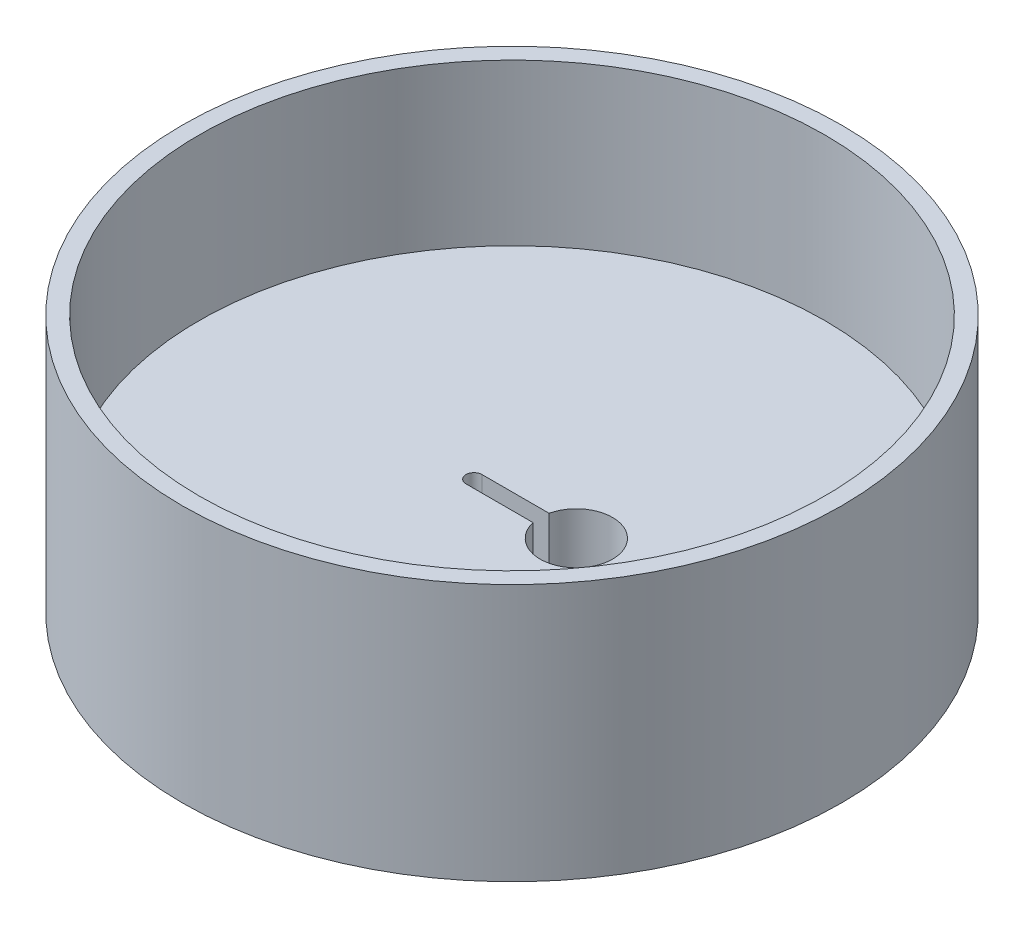
ISO-10303-21;
HEADER;
FILE_DESCRIPTION(('STEP AP214'),'2;1');
FILE_NAME('part.step','',(''),(''),'','','');
FILE_SCHEMA(('AUTOMOTIVE_DESIGN { 1 0 10303 214 1 1 1 1 }'));
ENDSEC;
DATA;
#1=APPLICATION_CONTEXT('core data for automotive mechanical design processes');
#2=APPLICATION_PROTOCOL_DEFINITION('international standard','automotive_design',2000,#1);
#3=PRODUCT_CONTEXT('',#1,'mechanical');
#4=PRODUCT('Part','Part','',(#3));
#5=PRODUCT_RELATED_PRODUCT_CATEGORY('part','',(#4));
#6=PRODUCT_DEFINITION_FORMATION('','',#4);
#7=PRODUCT_DEFINITION_CONTEXT('part definition',#1,'design');
#8=PRODUCT_DEFINITION('design','',#6,#7);
#9=PRODUCT_DEFINITION_SHAPE('','',#8);
#10=(LENGTH_UNIT() NAMED_UNIT(*) SI_UNIT(.MILLI.,.METRE.));
#11=(NAMED_UNIT(*) PLANE_ANGLE_UNIT() SI_UNIT($,.RADIAN.));
#12=(NAMED_UNIT(*) SI_UNIT($,.STERADIAN.) SOLID_ANGLE_UNIT());
#13=UNCERTAINTY_MEASURE_WITH_UNIT(LENGTH_MEASURE(1.E-05),#10,'distance_accuracy_value','');
#14=(GEOMETRIC_REPRESENTATION_CONTEXT(3) GLOBAL_UNCERTAINTY_ASSIGNED_CONTEXT((#13)) GLOBAL_UNIT_ASSIGNED_CONTEXT((#10,
#11,#12)) REPRESENTATION_CONTEXT('',''));
#15=CARTESIAN_POINT('',(0.,0.,0.));
#16=DIRECTION('',(0.,0.,1.));
#17=DIRECTION('',(1.,0.,0.));
#18=AXIS2_PLACEMENT_3D('',#15,#16,#17);
#19=CARTESIAN_POINT('',(0.,6.,0.));
#20=DIRECTION('',(0.,1.,0.));
#21=DIRECTION('',(0.,0.,1.));
#22=AXIS2_PLACEMENT_3D('',#19,#20,#21);
#23=PLANE('',#22);
#24=CARTESIAN_POINT('',(0.,6.,0.));
#25=DIRECTION('',(0.,1.,0.));
#26=DIRECTION('',(0.,0.,1.));
#27=AXIS2_PLACEMENT_3D('',#24,#25,#26);
#28=CIRCLE('',#27,19.45);
#29=CARTESIAN_POINT('',(0.,6.,19.45));
#30=VERTEX_POINT('',#29);
#31=EDGE_CURVE('E115',#30,#30,#28,.T.);
#32=ORIENTED_EDGE('',*,*,#31,.T.);
#33=EDGE_LOOP('',(#32));
#34=FACE_BOUND('',#33,.T.);
#35=DIRECTION('',(-1.,0.,0.));
#36=VECTOR('',#35,1.);
#37=CARTESIAN_POINT('',(1.80625890315197,6.,-0.5));
#38=LINE('',#37,#36);
#39=CARTESIAN_POINT('',(1.80625890315197,6.,-0.5));
#40=VERTEX_POINT('',#39);
#41=CARTESIAN_POINT('',(-2.36322899103991,6.,-0.5));
#42=VERTEX_POINT('',#41);
#43=EDGE_CURVE('E94',#40,#42,#38,.T.);
#44=ORIENTED_EDGE('',*,*,#43,.F.);
#45=CARTESIAN_POINT('',(4.,6.,0.));
#46=DIRECTION('',(0.,1.,0.));
#47=DIRECTION('',(0.,0.,1.));
#48=AXIS2_PLACEMENT_3D('',#45,#46,#47);
#49=CIRCLE('',#48,2.25);
#50=CARTESIAN_POINT('',(1.80625890315197,6.,0.499999999999999));
#51=VERTEX_POINT('',#50);
#52=EDGE_CURVE('E86',#51,#40,#49,.T.);
#53=ORIENTED_EDGE('',*,*,#52,.F.);
#54=DIRECTION('',(1.,0.,0.));
#55=VECTOR('',#54,1.);
#56=CARTESIAN_POINT('',(1.80625890315197,6.,0.499999999999999));
#57=LINE('',#56,#55);
#58=CARTESIAN_POINT('',(-2.36322899103991,6.,0.500000000000001));
#59=VERTEX_POINT('',#58);
#60=EDGE_CURVE('E107',#59,#51,#57,.T.);
#61=ORIENTED_EDGE('',*,*,#60,.F.);
#62=CARTESIAN_POINT('',(-2.36322899103991,6.,0.));
#63=DIRECTION('',(0.,1.,0.));
#64=DIRECTION('',(0.,0.,1.));
#65=AXIS2_PLACEMENT_3D('',#62,#63,#64);
#66=CIRCLE('',#65,0.5);
#67=EDGE_CURVE('E103',#42,#59,#66,.T.);
#68=ORIENTED_EDGE('',*,*,#67,.F.);
#69=EDGE_LOOP('',(#44,#53,#61,#68));
#70=FACE_BOUND('',#69,.T.);
#71=ADVANCED_FACE('F45',(#34,#70),#23,.T.);
#72=CARTESIAN_POINT('',(0.,0.,0.));
#73=DIRECTION('',(0.,1.,0.));
#74=DIRECTION('',(0.,0.,1.));
#75=AXIS2_PLACEMENT_3D('',#72,#73,#74);
#76=PLANE('',#75);
#77=CARTESIAN_POINT('',(4.,0.,0.));
#78=DIRECTION('',(0.,1.,0.));
#79=DIRECTION('',(0.,0.,1.));
#80=AXIS2_PLACEMENT_3D('',#77,#78,#79);
#81=CIRCLE('',#80,2.25);
#82=CARTESIAN_POINT('',(1.80625890315197,0.,0.499999999999999));
#83=VERTEX_POINT('',#82);
#84=CARTESIAN_POINT('',(1.80625890315197,0.,-0.5));
#85=VERTEX_POINT('',#84);
#86=EDGE_CURVE('E68',#83,#85,#81,.T.);
#87=ORIENTED_EDGE('',*,*,#86,.T.);
#88=DIRECTION('',(-1.,0.,0.));
#89=VECTOR('',#88,1.);
#90=CARTESIAN_POINT('',(1.80625890315197,0.,-0.5));
#91=LINE('',#90,#89);
#92=CARTESIAN_POINT('',(-2.36322899103991,0.,-0.5));
#93=VERTEX_POINT('',#92);
#94=EDGE_CURVE('E101',#85,#93,#91,.T.);
#95=ORIENTED_EDGE('',*,*,#94,.T.);
#96=CARTESIAN_POINT('',(-2.36322899103991,0.,0.));
#97=DIRECTION('',(0.,1.,0.));
#98=DIRECTION('',(0.,0.,1.));
#99=AXIS2_PLACEMENT_3D('',#96,#97,#98);
#100=CIRCLE('',#99,0.5);
#101=CARTESIAN_POINT('',(-2.36322899103991,0.,0.500000000000001));
#102=VERTEX_POINT('',#101);
#103=EDGE_CURVE('E118',#93,#102,#100,.T.);
#104=ORIENTED_EDGE('',*,*,#103,.T.);
#105=DIRECTION('',(1.,0.,0.));
#106=VECTOR('',#105,1.);
#107=CARTESIAN_POINT('',(1.80625890315197,0.,0.499999999999999));
#108=LINE('',#107,#106);
#109=EDGE_CURVE('E95',#102,#83,#108,.T.);
#110=ORIENTED_EDGE('',*,*,#109,.T.);
#111=EDGE_LOOP('',(#87,#95,#104,#110));
#112=FACE_BOUND('',#111,.T.);
#113=CARTESIAN_POINT('',(0.,0.,0.));
#114=DIRECTION('',(0.,1.,0.));
#115=DIRECTION('',(0.,0.,1.));
#116=AXIS2_PLACEMENT_3D('',#113,#114,#115);
#117=CIRCLE('',#116,20.5);
#118=CARTESIAN_POINT('',(0.,0.,20.5));
#119=VERTEX_POINT('',#118);
#120=EDGE_CURVE('E217',#119,#119,#117,.F.);
#121=ORIENTED_EDGE('',*,*,#120,.T.);
#122=EDGE_LOOP('',(#121));
#123=FACE_BOUND('',#122,.T.);
#124=ADVANCED_FACE('F47',(#112,#123),#76,.F.);
#125=CARTESIAN_POINT('',(4.,6.,0.));
#126=DIRECTION('',(0.,-1.,0.));
#127=DIRECTION('',(0.,0.,-1.));
#128=AXIS2_PLACEMENT_3D('',#125,#126,#127);
#129=CYLINDRICAL_SURFACE('',#128,2.25);
#130=ORIENTED_EDGE('',*,*,#86,.F.);
#131=DIRECTION('',(0.,-1.,0.));
#132=VECTOR('',#131,1.);
#133=CARTESIAN_POINT('',(1.80625890315197,6.,0.499999999999999));
#134=LINE('',#133,#132);
#135=EDGE_CURVE('E89',#51,#83,#134,.T.);
#136=ORIENTED_EDGE('',*,*,#135,.F.);
#137=ORIENTED_EDGE('',*,*,#52,.T.);
#138=DIRECTION('',(0.,-1.,0.));
#139=VECTOR('',#138,1.);
#140=CARTESIAN_POINT('',(1.80625890315197,6.,-0.5));
#141=LINE('',#140,#139);
#142=EDGE_CURVE('E11',#40,#85,#141,.T.);
#143=ORIENTED_EDGE('',*,*,#142,.T.);
#144=EDGE_LOOP('',(#130,#136,#137,#143));
#145=FACE_BOUND('',#144,.T.);
#146=ADVANCED_FACE('F88',(#145),#129,.F.);
#147=CARTESIAN_POINT('',(1.80625890315197,6.,-0.5));
#148=DIRECTION('',(0.,0.,1.));
#149=DIRECTION('',(1.,0.,0.));
#150=AXIS2_PLACEMENT_3D('',#147,#148,#149);
#151=PLANE('',#150);
#152=ORIENTED_EDGE('',*,*,#94,.F.);
#153=ORIENTED_EDGE('',*,*,#142,.F.);
#154=ORIENTED_EDGE('',*,*,#43,.T.);
#155=DIRECTION('',(0.,-1.,0.));
#156=VECTOR('',#155,1.);
#157=CARTESIAN_POINT('',(-2.36322899103991,6.,-0.5));
#158=LINE('',#157,#156);
#159=EDGE_CURVE('E54',#42,#93,#158,.T.);
#160=ORIENTED_EDGE('',*,*,#159,.T.);
#161=EDGE_LOOP('',(#152,#153,#154,#160));
#162=FACE_BOUND('',#161,.T.);
#163=ADVANCED_FACE('F98',(#162),#151,.T.);
#164=CARTESIAN_POINT('',(-2.36322899103991,6.,0.));
#165=DIRECTION('',(0.,-1.,0.));
#166=DIRECTION('',(0.,0.,-1.));
#167=AXIS2_PLACEMENT_3D('',#164,#165,#166);
#168=CYLINDRICAL_SURFACE('',#167,0.5);
#169=ORIENTED_EDGE('',*,*,#103,.F.);
#170=ORIENTED_EDGE('',*,*,#159,.F.);
#171=ORIENTED_EDGE('',*,*,#67,.T.);
#172=DIRECTION('',(0.,-1.,0.));
#173=VECTOR('',#172,1.);
#174=CARTESIAN_POINT('',(-2.36322899103991,6.,0.500000000000001));
#175=LINE('',#174,#173);
#176=EDGE_CURVE('E61',#59,#102,#175,.T.);
#177=ORIENTED_EDGE('',*,*,#176,.T.);
#178=EDGE_LOOP('',(#169,#170,#171,#177));
#179=FACE_BOUND('',#178,.T.);
#180=ADVANCED_FACE('F131',(#179),#168,.F.);
#181=CARTESIAN_POINT('',(1.80625890315197,6.,0.499999999999999));
#182=DIRECTION('',(0.,0.,-1.));
#183=DIRECTION('',(-1.,0.,0.));
#184=AXIS2_PLACEMENT_3D('',#181,#182,#183);
#185=PLANE('',#184);
#186=ORIENTED_EDGE('',*,*,#109,.F.);
#187=ORIENTED_EDGE('',*,*,#176,.F.);
#188=ORIENTED_EDGE('',*,*,#60,.T.);
#189=ORIENTED_EDGE('',*,*,#135,.T.);
#190=EDGE_LOOP('',(#186,#187,#188,#189));
#191=FACE_BOUND('',#190,.T.);
#192=ADVANCED_FACE('F134',(#191),#185,.T.);
#193=CARTESIAN_POINT('',(0.,-57.9827560572969,0.));
#194=DIRECTION('',(0.,1.,0.));
#195=DIRECTION('',(0.,0.,1.));
#196=AXIS2_PLACEMENT_3D('',#193,#194,#195);
#197=CYLINDRICAL_SURFACE('',#196,20.5);
#198=ORIENTED_EDGE('',*,*,#120,.F.);
#199=EDGE_LOOP('',(#198));
#200=FACE_BOUND('',#199,.T.);
#201=CARTESIAN_POINT('',(0.,16.,0.));
#202=DIRECTION('',(0.,1.,0.));
#203=DIRECTION('',(0.,0.,1.));
#204=AXIS2_PLACEMENT_3D('',#201,#202,#203);
#205=CIRCLE('',#204,20.5);
#206=CARTESIAN_POINT('',(0.,16.,20.5));
#207=VERTEX_POINT('',#206);
#208=EDGE_CURVE('E209',#207,#207,#205,.T.);
#209=ORIENTED_EDGE('',*,*,#208,.F.);
#210=EDGE_LOOP('',(#209));
#211=FACE_BOUND('',#210,.T.);
#212=ADVANCED_FACE('F136',(#200,#211),#197,.T.);
#213=CARTESIAN_POINT('',(0.,-57.9827560572969,0.));
#214=DIRECTION('',(0.,1.,0.));
#215=DIRECTION('',(0.,0.,1.));
#216=AXIS2_PLACEMENT_3D('',#213,#214,#215);
#217=CYLINDRICAL_SURFACE('',#216,19.45);
#218=ORIENTED_EDGE('',*,*,#31,.F.);
#219=EDGE_LOOP('',(#218));
#220=FACE_BOUND('',#219,.T.);
#221=CARTESIAN_POINT('',(0.,16.,0.));
#222=DIRECTION('',(0.,1.,0.));
#223=DIRECTION('',(0.,0.,1.));
#224=AXIS2_PLACEMENT_3D('',#221,#222,#223);
#225=CIRCLE('',#224,19.45);
#226=CARTESIAN_POINT('',(0.,16.,19.45));
#227=VERTEX_POINT('',#226);
#228=EDGE_CURVE('E212',#227,#227,#225,.T.);
#229=ORIENTED_EDGE('',*,*,#228,.T.);
#230=EDGE_LOOP('',(#229));
#231=FACE_BOUND('',#230,.T.);
#232=ADVANCED_FACE('F143',(#220,#231),#217,.F.);
#233=CARTESIAN_POINT('',(0.,16.,0.));
#234=DIRECTION('',(0.,1.,0.));
#235=DIRECTION('',(0.,0.,1.));
#236=AXIS2_PLACEMENT_3D('',#233,#234,#235);
#237=PLANE('',#236);
#238=ORIENTED_EDGE('',*,*,#208,.T.);
#239=EDGE_LOOP('',(#238));
#240=FACE_BOUND('',#239,.T.);
#241=ORIENTED_EDGE('',*,*,#228,.F.);
#242=EDGE_LOOP('',(#241));
#243=FACE_BOUND('',#242,.T.);
#244=ADVANCED_FACE('F193',(#240,#243),#237,.T.);
#245=CLOSED_SHELL('',(#71,#124,#146,#163,#180,#192,#212,#232,#244));
#246=MANIFOLD_SOLID_BREP('B2',#245);
#247=ADVANCED_BREP_SHAPE_REPRESENTATION('',(#18,#246),#14);
#248=SHAPE_DEFINITION_REPRESENTATION(#9,#247);
ENDSEC;
END-ISO-10303-21;
